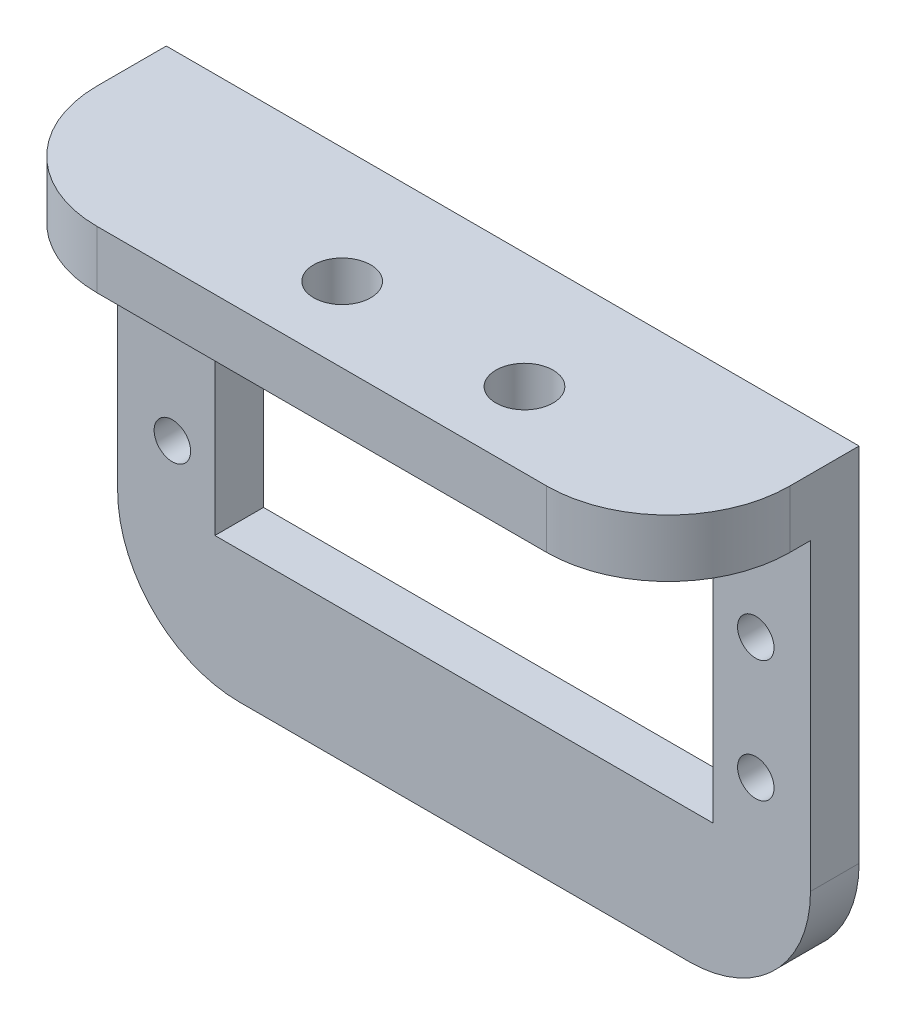
ISO-10303-21;
HEADER;
FILE_DESCRIPTION(('STEP AP214'),'2;1');
FILE_NAME('part.step','',(''),(''),'','','');
FILE_SCHEMA(('AUTOMOTIVE_DESIGN { 1 0 10303 214 1 1 1 1 }'));
ENDSEC;
DATA;
#1=APPLICATION_CONTEXT('core data for automotive mechanical design processes');
#2=APPLICATION_PROTOCOL_DEFINITION('international standard','automotive_design',2000,#1);
#3=PRODUCT_CONTEXT('',#1,'mechanical');
#4=PRODUCT('Part','Part','',(#3));
#5=PRODUCT_RELATED_PRODUCT_CATEGORY('part','',(#4));
#6=PRODUCT_DEFINITION_FORMATION('','',#4);
#7=PRODUCT_DEFINITION_CONTEXT('part definition',#1,'design');
#8=PRODUCT_DEFINITION('design','',#6,#7);
#9=PRODUCT_DEFINITION_SHAPE('','',#8);
#10=(LENGTH_UNIT() NAMED_UNIT(*) SI_UNIT(.MILLI.,.METRE.));
#11=(NAMED_UNIT(*) PLANE_ANGLE_UNIT() SI_UNIT($,.RADIAN.));
#12=(NAMED_UNIT(*) SI_UNIT($,.STERADIAN.) SOLID_ANGLE_UNIT());
#13=UNCERTAINTY_MEASURE_WITH_UNIT(LENGTH_MEASURE(1.E-05),#10,'distance_accuracy_value','');
#14=(GEOMETRIC_REPRESENTATION_CONTEXT(3) GLOBAL_UNCERTAINTY_ASSIGNED_CONTEXT((#13)) GLOBAL_UNIT_ASSIGNED_CONTEXT((#10,
#11,#12)) REPRESENTATION_CONTEXT('',''));
#15=CARTESIAN_POINT('',(0.,0.,0.));
#16=DIRECTION('',(0.,0.,1.));
#17=DIRECTION('',(1.,0.,0.));
#18=AXIS2_PLACEMENT_3D('',#15,#16,#17);
#19=CARTESIAN_POINT('',(-28.5,-20.86,-4.));
#20=DIRECTION('',(-1.,0.,0.));
#21=DIRECTION('',(0.,0.,1.));
#22=AXIS2_PLACEMENT_3D('',#19,#20,#21);
#23=PLANE('',#22);
#24=DIRECTION('',(0.,0.,1.));
#25=VECTOR('',#24,1.);
#26=CARTESIAN_POINT('',(-28.5,14.1400000000001,11.7));
#27=LINE('',#26,#25);
#28=CARTESIAN_POINT('',(-28.5,14.14,0.));
#29=VERTEX_POINT('',#28);
#30=CARTESIAN_POINT('',(-28.5,14.14,1.7));
#31=VERTEX_POINT('',#30);
#32=EDGE_CURVE('E205',#29,#31,#27,.T.);
#33=ORIENTED_EDGE('',*,*,#32,.T.);
#34=DIRECTION('',(0.,1.,0.));
#35=VECTOR('',#34,1.);
#36=CARTESIAN_POINT('',(-28.5,18.8766,1.69999999999998));
#37=LINE('',#36,#35);
#38=CARTESIAN_POINT('',(-28.5,18.8766,1.69999999999998));
#39=VERTEX_POINT('',#38);
#40=EDGE_CURVE('E13',#31,#39,#37,.T.);
#41=ORIENTED_EDGE('',*,*,#40,.T.);
#42=DIRECTION('',(0.,0.,1.));
#43=VECTOR('',#42,1.);
#44=CARTESIAN_POINT('',(-28.5,18.8766,0.));
#45=LINE('',#44,#43);
#46=CARTESIAN_POINT('',(-28.5,18.8766,-4.00000000000001));
#47=VERTEX_POINT('',#46);
#48=EDGE_CURVE('E179',#47,#39,#45,.T.);
#49=ORIENTED_EDGE('',*,*,#48,.F.);
#50=DIRECTION('',(0.,-1.,0.));
#51=VECTOR('',#50,1.);
#52=CARTESIAN_POINT('',(-28.5,-20.86,-4.));
#53=LINE('',#52,#51);
#54=CARTESIAN_POINT('',(-28.5,-10.86,-4.));
#55=VERTEX_POINT('',#54);
#56=EDGE_CURVE('E197',#47,#55,#53,.T.);
#57=ORIENTED_EDGE('',*,*,#56,.T.);
#58=DIRECTION('',(0.,0.,1.));
#59=VECTOR('',#58,1.);
#60=CARTESIAN_POINT('',(-28.5,-10.86,-4.));
#61=LINE('',#60,#59);
#62=CARTESIAN_POINT('',(-28.5,-10.86,0.));
#63=VERTEX_POINT('',#62);
#64=EDGE_CURVE('E191',#55,#63,#61,.T.);
#65=ORIENTED_EDGE('',*,*,#64,.T.);
#66=DIRECTION('',(0.,-1.,0.));
#67=VECTOR('',#66,1.);
#68=CARTESIAN_POINT('',(-28.5,-20.86,0.));
#69=LINE('',#68,#67);
#70=EDGE_CURVE('E285',#29,#63,#69,.T.);
#71=ORIENTED_EDGE('',*,*,#70,.F.);
#72=EDGE_LOOP('',(#33,#41,#49,#57,#65,#71));
#73=FACE_BOUND('',#72,.T.);
#74=ADVANCED_FACE('F67',(#73),#23,.T.);
#75=CARTESIAN_POINT('',(28.5,-20.86,-4.));
#76=DIRECTION('',(1.,0.,0.));
#77=DIRECTION('',(0.,0.,-1.));
#78=AXIS2_PLACEMENT_3D('',#75,#76,#77);
#79=PLANE('',#78);
#80=DIRECTION('',(0.,0.,-1.));
#81=VECTOR('',#80,1.);
#82=CARTESIAN_POINT('',(28.5,18.8766,0.));
#83=LINE('',#82,#81);
#84=CARTESIAN_POINT('',(28.5,18.8766,1.69999999999998));
#85=VERTEX_POINT('',#84);
#86=CARTESIAN_POINT('',(28.5,18.8766,-4.00000000000001));
#87=VERTEX_POINT('',#86);
#88=EDGE_CURVE('E170',#85,#87,#83,.T.);
#89=ORIENTED_EDGE('',*,*,#88,.F.);
#90=DIRECTION('',(0.,1.,0.));
#91=VECTOR('',#90,1.);
#92=CARTESIAN_POINT('',(28.5,14.14,1.7));
#93=LINE('',#92,#91);
#94=CARTESIAN_POINT('',(28.5,14.14,1.7));
#95=VERTEX_POINT('',#94);
#96=EDGE_CURVE('E91',#85,#95,#93,.F.);
#97=ORIENTED_EDGE('',*,*,#96,.T.);
#98=DIRECTION('',(0.,0.,-1.));
#99=VECTOR('',#98,1.);
#100=CARTESIAN_POINT('',(28.5,14.1400000000001,11.7));
#101=LINE('',#100,#99);
#102=CARTESIAN_POINT('',(28.5,14.14,0.));
#103=VERTEX_POINT('',#102);
#104=EDGE_CURVE('E200',#95,#103,#101,.T.);
#105=ORIENTED_EDGE('',*,*,#104,.T.);
#106=DIRECTION('',(0.,1.,0.));
#107=VECTOR('',#106,1.);
#108=CARTESIAN_POINT('',(28.5,-20.86,0.));
#109=LINE('',#108,#107);
#110=CARTESIAN_POINT('',(28.5,-10.86,0.));
#111=VERTEX_POINT('',#110);
#112=EDGE_CURVE('E308',#111,#103,#109,.T.);
#113=ORIENTED_EDGE('',*,*,#112,.F.);
#114=DIRECTION('',(0.,0.,1.));
#115=VECTOR('',#114,1.);
#116=CARTESIAN_POINT('',(28.5,-10.86,-4.));
#117=LINE('',#116,#115);
#118=CARTESIAN_POINT('',(28.5,-10.86,-4.));
#119=VERTEX_POINT('',#118);
#120=EDGE_CURVE('E187',#111,#119,#117,.F.);
#121=ORIENTED_EDGE('',*,*,#120,.T.);
#122=DIRECTION('',(0.,1.,0.));
#123=VECTOR('',#122,1.);
#124=CARTESIAN_POINT('',(28.5,-20.86,-4.));
#125=LINE('',#124,#123);
#126=EDGE_CURVE('E183',#119,#87,#125,.T.);
#127=ORIENTED_EDGE('',*,*,#126,.T.);
#128=EDGE_LOOP('',(#89,#97,#105,#113,#121,#127));
#129=FACE_BOUND('',#128,.T.);
#130=ADVANCED_FACE('F184',(#129),#79,.T.);
#131=CARTESIAN_POINT('',(-28.5,-20.86,-4.));
#132=DIRECTION('',(0.,-1.,0.));
#133=DIRECTION('',(0.,0.,-1.));
#134=AXIS2_PLACEMENT_3D('',#131,#132,#133);
#135=PLANE('',#134);
#136=DIRECTION('',(1.,0.,0.));
#137=VECTOR('',#136,1.);
#138=CARTESIAN_POINT('',(-28.5,-20.86,0.));
#139=LINE('',#138,#137);
#140=CARTESIAN_POINT('',(-18.5,-20.86,0.));
#141=VERTEX_POINT('',#140);
#142=CARTESIAN_POINT('',(18.5,-20.86,0.));
#143=VERTEX_POINT('',#142);
#144=EDGE_CURVE('E304',#141,#143,#139,.T.);
#145=ORIENTED_EDGE('',*,*,#144,.F.);
#146=DIRECTION('',(0.,0.,1.));
#147=VECTOR('',#146,1.);
#148=CARTESIAN_POINT('',(-18.5,-20.86,-4.));
#149=LINE('',#148,#147);
#150=CARTESIAN_POINT('',(-18.5,-20.86,-4.));
#151=VERTEX_POINT('',#150);
#152=EDGE_CURVE('E328',#141,#151,#149,.F.);
#153=ORIENTED_EDGE('',*,*,#152,.T.);
#154=DIRECTION('',(1.,0.,0.));
#155=VECTOR('',#154,1.);
#156=CARTESIAN_POINT('',(-28.5,-20.86,-4.));
#157=LINE('',#156,#155);
#158=CARTESIAN_POINT('',(18.5,-20.86,-4.));
#159=VERTEX_POINT('',#158);
#160=EDGE_CURVE('E192',#151,#159,#157,.T.);
#161=ORIENTED_EDGE('',*,*,#160,.T.);
#162=DIRECTION('',(0.,0.,1.));
#163=VECTOR('',#162,1.);
#164=CARTESIAN_POINT('',(18.5,-20.86,-4.));
#165=LINE('',#164,#163);
#166=EDGE_CURVE('E324',#159,#143,#165,.T.);
#167=ORIENTED_EDGE('',*,*,#166,.T.);
#168=EDGE_LOOP('',(#145,#153,#161,#167));
#169=FACE_BOUND('',#168,.T.);
#170=ADVANCED_FACE('F388',(#169),#135,.T.);
#171=CARTESIAN_POINT('',(0.,0.,-4.));
#172=DIRECTION('',(0.,0.,-1.));
#173=DIRECTION('',(-1.,0.,0.));
#174=AXIS2_PLACEMENT_3D('',#171,#172,#173);
#175=PLANE('',#174);
#176=CARTESIAN_POINT('',(-24.,-5.,-4.));
#177=DIRECTION('',(0.,0.,1.));
#178=DIRECTION('',(-1.,0.,0.));
#179=AXIS2_PLACEMENT_3D('',#176,#177,#178);
#180=CIRCLE('',#179,1.5);
#181=CARTESIAN_POINT('',(-25.5,-5.,-4.));
#182=VERTEX_POINT('',#181);
#183=EDGE_CURVE('E219',#182,#182,#180,.T.);
#184=ORIENTED_EDGE('',*,*,#183,.T.);
#185=EDGE_LOOP('',(#184));
#186=FACE_BOUND('',#185,.T.);
#187=CARTESIAN_POINT('',(24.,-5.,-4.));
#188=DIRECTION('',(0.,0.,1.));
#189=DIRECTION('',(1.,0.,0.));
#190=AXIS2_PLACEMENT_3D('',#187,#188,#189);
#191=CIRCLE('',#190,1.5);
#192=CARTESIAN_POINT('',(25.5,-5.,-4.));
#193=VERTEX_POINT('',#192);
#194=EDGE_CURVE('E227',#193,#193,#191,.T.);
#195=ORIENTED_EDGE('',*,*,#194,.T.);
#196=EDGE_LOOP('',(#195));
#197=FACE_BOUND('',#196,.T.);
#198=CARTESIAN_POINT('',(24.,5.,-4.));
#199=DIRECTION('',(0.,0.,1.));
#200=DIRECTION('',(-1.,0.,0.));
#201=AXIS2_PLACEMENT_3D('',#198,#199,#200);
#202=CIRCLE('',#201,1.5);
#203=CARTESIAN_POINT('',(22.5,5.,-4.));
#204=VERTEX_POINT('',#203);
#205=EDGE_CURVE('E235',#204,#204,#202,.T.);
#206=ORIENTED_EDGE('',*,*,#205,.T.);
#207=EDGE_LOOP('',(#206));
#208=FACE_BOUND('',#207,.T.);
#209=CARTESIAN_POINT('',(-24.,5.,-4.));
#210=DIRECTION('',(0.,0.,1.));
#211=DIRECTION('',(1.,0.,0.));
#212=AXIS2_PLACEMENT_3D('',#209,#210,#211);
#213=CIRCLE('',#212,1.5);
#214=CARTESIAN_POINT('',(-22.5,5.,-4.));
#215=VERTEX_POINT('',#214);
#216=EDGE_CURVE('E243',#215,#215,#213,.T.);
#217=ORIENTED_EDGE('',*,*,#216,.T.);
#218=EDGE_LOOP('',(#217));
#219=FACE_BOUND('',#218,.T.);
#220=DIRECTION('',(0.,1.,0.));
#221=VECTOR('',#220,1.);
#222=CARTESIAN_POINT('',(20.5,-10.,-4.));
#223=LINE('',#222,#221);
#224=CARTESIAN_POINT('',(20.5,-10.,-4.));
#225=VERTEX_POINT('',#224);
#226=CARTESIAN_POINT('',(20.5,9.99999999999999,-4.));
#227=VERTEX_POINT('',#226);
#228=EDGE_CURVE('E251',#225,#227,#223,.T.);
#229=ORIENTED_EDGE('',*,*,#228,.T.);
#230=DIRECTION('',(-1.,0.,0.));
#231=VECTOR('',#230,1.);
#232=CARTESIAN_POINT('',(-20.5,9.99999999999999,-4.));
#233=LINE('',#232,#231);
#234=CARTESIAN_POINT('',(-20.5,9.99999999999999,-4.));
#235=VERTEX_POINT('',#234);
#236=EDGE_CURVE('E255',#227,#235,#233,.T.);
#237=ORIENTED_EDGE('',*,*,#236,.T.);
#238=DIRECTION('',(0.,-1.,0.));
#239=VECTOR('',#238,1.);
#240=CARTESIAN_POINT('',(-20.5,-10.,-4.));
#241=LINE('',#240,#239);
#242=CARTESIAN_POINT('',(-20.5,-10.,-4.));
#243=VERTEX_POINT('',#242);
#244=EDGE_CURVE('E260',#235,#243,#241,.T.);
#245=ORIENTED_EDGE('',*,*,#244,.T.);
#246=DIRECTION('',(1.,0.,0.));
#247=VECTOR('',#246,1.);
#248=CARTESIAN_POINT('',(-20.5,-10.,-4.));
#249=LINE('',#248,#247);
#250=EDGE_CURVE('E264',#243,#225,#249,.T.);
#251=ORIENTED_EDGE('',*,*,#250,.T.);
#252=EDGE_LOOP('',(#229,#237,#245,#251));
#253=FACE_BOUND('',#252,.T.);
#254=ORIENTED_EDGE('',*,*,#160,.F.);
#255=CARTESIAN_POINT('',(-18.5,-10.86,-4.));
#256=DIRECTION('',(0.,0.,-1.));
#257=DIRECTION('',(-1.,0.,0.));
#258=AXIS2_PLACEMENT_3D('',#255,#256,#257);
#259=CIRCLE('',#258,10.);
#260=EDGE_CURVE('E334',#151,#55,#259,.T.);
#261=ORIENTED_EDGE('',*,*,#260,.T.);
#262=ORIENTED_EDGE('',*,*,#56,.F.);
#263=DIRECTION('',(-1.,0.,0.));
#264=VECTOR('',#263,1.);
#265=CARTESIAN_POINT('',(28.5,18.8766,-4.00000000000001));
#266=LINE('',#265,#264);
#267=EDGE_CURVE('E176',#87,#47,#266,.T.);
#268=ORIENTED_EDGE('',*,*,#267,.F.);
#269=ORIENTED_EDGE('',*,*,#126,.F.);
#270=CARTESIAN_POINT('',(18.5,-10.86,-4.));
#271=DIRECTION('',(0.,0.,-1.));
#272=DIRECTION('',(-1.,0.,0.));
#273=AXIS2_PLACEMENT_3D('',#270,#271,#272);
#274=CIRCLE('',#273,10.);
#275=EDGE_CURVE('E331',#119,#159,#274,.T.);
#276=ORIENTED_EDGE('',*,*,#275,.T.);
#277=EDGE_LOOP('',(#254,#261,#262,#268,#269,#276));
#278=FACE_BOUND('',#277,.T.);
#279=ADVANCED_FACE('F195',(#186,#197,#208,#219,#253,#278),#175,.T.);
#280=CARTESIAN_POINT('',(0.,0.,0.));
#281=DIRECTION('',(0.,0.,-1.));
#282=DIRECTION('',(-1.,0.,0.));
#283=AXIS2_PLACEMENT_3D('',#280,#281,#282);
#284=PLANE('',#283);
#285=CARTESIAN_POINT('',(-24.,-5.,0.));
#286=DIRECTION('',(0.,0.,1.));
#287=DIRECTION('',(-1.,0.,0.));
#288=AXIS2_PLACEMENT_3D('',#285,#286,#287);
#289=CIRCLE('',#288,1.5);
#290=CARTESIAN_POINT('',(-25.5,-5.,0.));
#291=VERTEX_POINT('',#290);
#292=EDGE_CURVE('E216',#291,#291,#289,.T.);
#293=ORIENTED_EDGE('',*,*,#292,.F.);
#294=EDGE_LOOP('',(#293));
#295=FACE_BOUND('',#294,.T.);
#296=CARTESIAN_POINT('',(24.,-5.,0.));
#297=DIRECTION('',(0.,0.,1.));
#298=DIRECTION('',(1.,0.,0.));
#299=AXIS2_PLACEMENT_3D('',#296,#297,#298);
#300=CIRCLE('',#299,1.5);
#301=CARTESIAN_POINT('',(25.5,-5.,0.));
#302=VERTEX_POINT('',#301);
#303=EDGE_CURVE('E223',#302,#302,#300,.T.);
#304=ORIENTED_EDGE('',*,*,#303,.F.);
#305=EDGE_LOOP('',(#304));
#306=FACE_BOUND('',#305,.T.);
#307=CARTESIAN_POINT('',(24.,5.,0.));
#308=DIRECTION('',(0.,0.,1.));
#309=DIRECTION('',(-1.,0.,0.));
#310=AXIS2_PLACEMENT_3D('',#307,#308,#309);
#311=CIRCLE('',#310,1.5);
#312=CARTESIAN_POINT('',(22.5,5.,0.));
#313=VERTEX_POINT('',#312);
#314=EDGE_CURVE('E231',#313,#313,#311,.T.);
#315=ORIENTED_EDGE('',*,*,#314,.F.);
#316=EDGE_LOOP('',(#315));
#317=FACE_BOUND('',#316,.T.);
#318=CARTESIAN_POINT('',(-24.,5.,0.));
#319=DIRECTION('',(0.,0.,1.));
#320=DIRECTION('',(1.,0.,0.));
#321=AXIS2_PLACEMENT_3D('',#318,#319,#320);
#322=CIRCLE('',#321,1.5);
#323=CARTESIAN_POINT('',(-22.5,5.,0.));
#324=VERTEX_POINT('',#323);
#325=EDGE_CURVE('E239',#324,#324,#322,.T.);
#326=ORIENTED_EDGE('',*,*,#325,.F.);
#327=EDGE_LOOP('',(#326));
#328=FACE_BOUND('',#327,.T.);
#329=DIRECTION('',(-1.,0.,0.));
#330=VECTOR('',#329,1.);
#331=CARTESIAN_POINT('',(-20.5,9.99999999999999,0.));
#332=LINE('',#331,#330);
#333=CARTESIAN_POINT('',(20.5,9.99999999999999,0.));
#334=VERTEX_POINT('',#333);
#335=CARTESIAN_POINT('',(-20.5,9.99999999999999,0.));
#336=VERTEX_POINT('',#335);
#337=EDGE_CURVE('E271',#334,#336,#332,.T.);
#338=ORIENTED_EDGE('',*,*,#337,.F.);
#339=DIRECTION('',(0.,1.,0.));
#340=VECTOR('',#339,1.);
#341=CARTESIAN_POINT('',(20.5,-10.,0.));
#342=LINE('',#341,#340);
#343=CARTESIAN_POINT('',(20.5,-10.,0.));
#344=VERTEX_POINT('',#343);
#345=EDGE_CURVE('E247',#344,#334,#342,.T.);
#346=ORIENTED_EDGE('',*,*,#345,.F.);
#347=DIRECTION('',(1.,0.,0.));
#348=VECTOR('',#347,1.);
#349=CARTESIAN_POINT('',(-20.5,-10.,0.));
#350=LINE('',#349,#348);
#351=CARTESIAN_POINT('',(-20.5,-10.,0.));
#352=VERTEX_POINT('',#351);
#353=EDGE_CURVE('E256',#352,#344,#350,.T.);
#354=ORIENTED_EDGE('',*,*,#353,.F.);
#355=DIRECTION('',(0.,-1.,0.));
#356=VECTOR('',#355,1.);
#357=CARTESIAN_POINT('',(-20.5,-10.,0.));
#358=LINE('',#357,#356);
#359=EDGE_CURVE('E275',#336,#352,#358,.T.);
#360=ORIENTED_EDGE('',*,*,#359,.F.);
#361=EDGE_LOOP('',(#338,#346,#354,#360));
#362=FACE_BOUND('',#361,.T.);
#363=ORIENTED_EDGE('',*,*,#70,.T.);
#364=CARTESIAN_POINT('',(-18.5,-10.86,0.));
#365=DIRECTION('',(0.,0.,-1.));
#366=DIRECTION('',(-1.,0.,0.));
#367=AXIS2_PLACEMENT_3D('',#364,#365,#366);
#368=CIRCLE('',#367,10.);
#369=EDGE_CURVE('E321',#63,#141,#368,.F.);
#370=ORIENTED_EDGE('',*,*,#369,.T.);
#371=ORIENTED_EDGE('',*,*,#144,.T.);
#372=CARTESIAN_POINT('',(18.5,-10.86,0.));
#373=DIRECTION('',(0.,0.,-1.));
#374=DIRECTION('',(-1.,0.,0.));
#375=AXIS2_PLACEMENT_3D('',#372,#373,#374);
#376=CIRCLE('',#375,10.);
#377=EDGE_CURVE('E318',#143,#111,#376,.F.);
#378=ORIENTED_EDGE('',*,*,#377,.T.);
#379=ORIENTED_EDGE('',*,*,#112,.T.);
#380=DIRECTION('',(-1.,0.,0.));
#381=VECTOR('',#380,1.);
#382=CARTESIAN_POINT('',(-28.5,14.14,0.));
#383=LINE('',#382,#381);
#384=EDGE_CURVE('E297',#103,#29,#383,.T.);
#385=ORIENTED_EDGE('',*,*,#384,.T.);
#386=EDGE_LOOP('',(#363,#370,#371,#378,#379,#385));
#387=FACE_BOUND('',#386,.T.);
#388=ADVANCED_FACE('F468',(#295,#306,#317,#328,#362,#387),#284,.F.);
#389=CARTESIAN_POINT('',(20.5,-10.,-4.));
#390=DIRECTION('',(1.,0.,0.));
#391=DIRECTION('',(0.,0.,-1.));
#392=AXIS2_PLACEMENT_3D('',#389,#390,#391);
#393=PLANE('',#392);
#394=ORIENTED_EDGE('',*,*,#345,.T.);
#395=DIRECTION('',(0.,0.,1.));
#396=VECTOR('',#395,1.);
#397=CARTESIAN_POINT('',(20.5,9.99999999999999,-4.));
#398=LINE('',#397,#396);
#399=EDGE_CURVE('E268',#227,#334,#398,.T.);
#400=ORIENTED_EDGE('',*,*,#399,.F.);
#401=ORIENTED_EDGE('',*,*,#228,.F.);
#402=DIRECTION('',(0.,0.,1.));
#403=VECTOR('',#402,1.);
#404=CARTESIAN_POINT('',(20.5,-10.,-4.));
#405=LINE('',#404,#403);
#406=EDGE_CURVE('E282',#225,#344,#405,.T.);
#407=ORIENTED_EDGE('',*,*,#406,.T.);
#408=EDGE_LOOP('',(#394,#400,#401,#407));
#409=FACE_BOUND('',#408,.T.);
#410=ADVANCED_FACE('F458',(#409),#393,.F.);
#411=CARTESIAN_POINT('',(-20.5,-10.,-4.));
#412=DIRECTION('',(0.,-1.,0.));
#413=DIRECTION('',(0.,0.,-1.));
#414=AXIS2_PLACEMENT_3D('',#411,#412,#413);
#415=PLANE('',#414);
#416=ORIENTED_EDGE('',*,*,#353,.T.);
#417=ORIENTED_EDGE('',*,*,#406,.F.);
#418=ORIENTED_EDGE('',*,*,#250,.F.);
#419=DIRECTION('',(0.,0.,1.));
#420=VECTOR('',#419,1.);
#421=CARTESIAN_POINT('',(-20.5,-10.,-4.));
#422=LINE('',#421,#420);
#423=EDGE_CURVE('E286',#243,#352,#422,.T.);
#424=ORIENTED_EDGE('',*,*,#423,.T.);
#425=EDGE_LOOP('',(#416,#417,#418,#424));
#426=FACE_BOUND('',#425,.T.);
#427=ADVANCED_FACE('F454',(#426),#415,.F.);
#428=CARTESIAN_POINT('',(-20.5,-10.,-4.));
#429=DIRECTION('',(-1.,0.,0.));
#430=DIRECTION('',(0.,0.,1.));
#431=AXIS2_PLACEMENT_3D('',#428,#429,#430);
#432=PLANE('',#431);
#433=ORIENTED_EDGE('',*,*,#359,.T.);
#434=ORIENTED_EDGE('',*,*,#423,.F.);
#435=ORIENTED_EDGE('',*,*,#244,.F.);
#436=DIRECTION('',(0.,0.,1.));
#437=VECTOR('',#436,1.);
#438=CARTESIAN_POINT('',(-20.5,9.99999999999999,-4.));
#439=LINE('',#438,#437);
#440=EDGE_CURVE('E289',#235,#336,#439,.T.);
#441=ORIENTED_EDGE('',*,*,#440,.T.);
#442=EDGE_LOOP('',(#433,#434,#435,#441));
#443=FACE_BOUND('',#442,.T.);
#444=ADVANCED_FACE('F457',(#443),#432,.F.);
#445=CARTESIAN_POINT('',(-20.5,9.99999999999999,-4.));
#446=DIRECTION('',(0.,1.,0.));
#447=DIRECTION('',(0.,0.,1.));
#448=AXIS2_PLACEMENT_3D('',#445,#446,#447);
#449=PLANE('',#448);
#450=ORIENTED_EDGE('',*,*,#337,.T.);
#451=ORIENTED_EDGE('',*,*,#440,.F.);
#452=ORIENTED_EDGE('',*,*,#236,.F.);
#453=ORIENTED_EDGE('',*,*,#399,.T.);
#454=EDGE_LOOP('',(#450,#451,#452,#453));
#455=FACE_BOUND('',#454,.T.);
#456=ADVANCED_FACE('F452',(#455),#449,.F.);
#457=CARTESIAN_POINT('',(-24.,5.,-4.));
#458=DIRECTION('',(0.,0.,1.));
#459=DIRECTION('',(1.,0.,0.));
#460=AXIS2_PLACEMENT_3D('',#457,#458,#459);
#461=CYLINDRICAL_SURFACE('',#460,1.5);
#462=ORIENTED_EDGE('',*,*,#216,.F.);
#463=EDGE_LOOP('',(#462));
#464=FACE_BOUND('',#463,.T.);
#465=ORIENTED_EDGE('',*,*,#325,.T.);
#466=EDGE_LOOP('',(#465));
#467=FACE_BOUND('',#466,.T.);
#468=ADVANCED_FACE('F448',(#464,#467),#461,.F.);
#469=CARTESIAN_POINT('',(24.,5.,-4.));
#470=DIRECTION('',(0.,0.,1.));
#471=DIRECTION('',(1.,0.,0.));
#472=AXIS2_PLACEMENT_3D('',#469,#470,#471);
#473=CYLINDRICAL_SURFACE('',#472,1.5);
#474=ORIENTED_EDGE('',*,*,#205,.F.);
#475=EDGE_LOOP('',(#474));
#476=FACE_BOUND('',#475,.T.);
#477=ORIENTED_EDGE('',*,*,#314,.T.);
#478=EDGE_LOOP('',(#477));
#479=FACE_BOUND('',#478,.T.);
#480=ADVANCED_FACE('F444',(#476,#479),#473,.F.);
#481=CARTESIAN_POINT('',(24.,-5.,-4.));
#482=DIRECTION('',(0.,0.,1.));
#483=DIRECTION('',(1.,0.,0.));
#484=AXIS2_PLACEMENT_3D('',#481,#482,#483);
#485=CYLINDRICAL_SURFACE('',#484,1.5);
#486=ORIENTED_EDGE('',*,*,#194,.F.);
#487=EDGE_LOOP('',(#486));
#488=FACE_BOUND('',#487,.T.);
#489=ORIENTED_EDGE('',*,*,#303,.T.);
#490=EDGE_LOOP('',(#489));
#491=FACE_BOUND('',#490,.T.);
#492=ADVANCED_FACE('F440',(#488,#491),#485,.F.);
#493=CARTESIAN_POINT('',(-24.,-5.,-4.));
#494=DIRECTION('',(0.,0.,1.));
#495=DIRECTION('',(1.,0.,0.));
#496=AXIS2_PLACEMENT_3D('',#493,#494,#495);
#497=CYLINDRICAL_SURFACE('',#496,1.5);
#498=ORIENTED_EDGE('',*,*,#183,.F.);
#499=EDGE_LOOP('',(#498));
#500=FACE_BOUND('',#499,.T.);
#501=ORIENTED_EDGE('',*,*,#292,.T.);
#502=EDGE_LOOP('',(#501));
#503=FACE_BOUND('',#502,.T.);
#504=ADVANCED_FACE('F424',(#500,#503),#497,.F.);
#505=CARTESIAN_POINT('',(0.,18.8766,0.));
#506=DIRECTION('',(0.,-1.,0.));
#507=DIRECTION('',(0.,0.,-1.));
#508=AXIS2_PLACEMENT_3D('',#505,#506,#507);
#509=PLANE('',#508);
#510=CARTESIAN_POINT('',(10.5,18.8766,5.53000000000001));
#511=DIRECTION('',(0.,1.,0.));
#512=DIRECTION('',(0.,0.,1.));
#513=AXIS2_PLACEMENT_3D('',#510,#511,#512);
#514=CIRCLE('',#513,2.35);
#515=CARTESIAN_POINT('',(10.5,18.8766,7.88000000000001));
#516=VERTEX_POINT('',#515);
#517=EDGE_CURVE('E342',#516,#516,#514,.T.);
#518=ORIENTED_EDGE('',*,*,#517,.F.);
#519=EDGE_LOOP('',(#518));
#520=FACE_BOUND('',#519,.T.);
#521=CARTESIAN_POINT('',(-4.50000000000001,18.8766,5.53000000000001));
#522=DIRECTION('',(0.,1.,0.));
#523=DIRECTION('',(0.,0.,1.));
#524=AXIS2_PLACEMENT_3D('',#521,#522,#523);
#525=CIRCLE('',#524,2.35);
#526=CARTESIAN_POINT('',(-4.50000000000001,18.8766,7.88000000000001));
#527=VERTEX_POINT('',#526);
#528=EDGE_CURVE('E413',#527,#527,#525,.T.);
#529=ORIENTED_EDGE('',*,*,#528,.F.);
#530=EDGE_LOOP('',(#529));
#531=FACE_BOUND('',#530,.T.);
#532=DIRECTION('',(1.,0.,0.));
#533=VECTOR('',#532,1.);
#534=CARTESIAN_POINT('',(0.,18.8766,11.7));
#535=LINE('',#534,#533);
#536=CARTESIAN_POINT('',(-18.5,18.8766,11.7));
#537=VERTEX_POINT('',#536);
#538=CARTESIAN_POINT('',(18.5,18.8766,11.7));
#539=VERTEX_POINT('',#538);
#540=EDGE_CURVE('E213',#537,#539,#535,.T.);
#541=ORIENTED_EDGE('',*,*,#540,.T.);
#542=CARTESIAN_POINT('',(18.5,18.8766,1.69999999999998));
#543=DIRECTION('',(0.,-1.,0.));
#544=DIRECTION('',(0.,0.,-1.));
#545=AXIS2_PLACEMENT_3D('',#542,#543,#544);
#546=CIRCLE('',#545,10.);
#547=EDGE_CURVE('E177',#539,#85,#546,.F.);
#548=ORIENTED_EDGE('',*,*,#547,.T.);
#549=ORIENTED_EDGE('',*,*,#88,.T.);
#550=ORIENTED_EDGE('',*,*,#267,.T.);
#551=ORIENTED_EDGE('',*,*,#48,.T.);
#552=CARTESIAN_POINT('',(-18.5,18.8766,1.69999999999998));
#553=DIRECTION('',(0.,-1.,0.));
#554=DIRECTION('',(0.,0.,-1.));
#555=AXIS2_PLACEMENT_3D('',#552,#553,#554);
#556=CIRCLE('',#555,10.);
#557=EDGE_CURVE('E350',#39,#537,#556,.F.);
#558=ORIENTED_EDGE('',*,*,#557,.T.);
#559=EDGE_LOOP('',(#541,#548,#549,#550,#551,#558));
#560=FACE_BOUND('',#559,.T.);
#561=ADVANCED_FACE('F173',(#520,#531,#560),#509,.F.);
#562=CARTESIAN_POINT('',(28.5,18.8766,11.7));
#563=DIRECTION('',(0.,0.,-1.));
#564=DIRECTION('',(0.,1.,0.));
#565=AXIS2_PLACEMENT_3D('',#562,#563,#564);
#566=PLANE('',#565);
#567=DIRECTION('',(1.,0.,0.));
#568=VECTOR('',#567,1.);
#569=CARTESIAN_POINT('',(28.5,14.1400000000001,11.7));
#570=LINE('',#569,#568);
#571=CARTESIAN_POINT('',(-18.5,14.1400000000001,11.7));
#572=VERTEX_POINT('',#571);
#573=CARTESIAN_POINT('',(18.5,14.1400000000001,11.7));
#574=VERTEX_POINT('',#573);
#575=EDGE_CURVE('E180',#572,#574,#570,.T.);
#576=ORIENTED_EDGE('',*,*,#575,.T.);
#577=DIRECTION('',(0.,1.,0.));
#578=VECTOR('',#577,1.);
#579=CARTESIAN_POINT('',(18.5,18.8766,11.7));
#580=LINE('',#579,#578);
#581=EDGE_CURVE('E346',#574,#539,#580,.T.);
#582=ORIENTED_EDGE('',*,*,#581,.T.);
#583=ORIENTED_EDGE('',*,*,#540,.F.);
#584=DIRECTION('',(0.,1.,0.));
#585=VECTOR('',#584,1.);
#586=CARTESIAN_POINT('',(-18.5,14.1400000000001,11.7));
#587=LINE('',#586,#585);
#588=EDGE_CURVE('E339',#537,#572,#587,.F.);
#589=ORIENTED_EDGE('',*,*,#588,.T.);
#590=EDGE_LOOP('',(#576,#582,#583,#589));
#591=FACE_BOUND('',#590,.T.);
#592=ADVANCED_FACE('F366',(#591),#566,.F.);
#593=CARTESIAN_POINT('',(-18.5,-10.86,-4.));
#594=DIRECTION('',(0.,0.,1.));
#595=DIRECTION('',(1.,0.,0.));
#596=AXIS2_PLACEMENT_3D('',#593,#594,#595);
#597=CYLINDRICAL_SURFACE('',#596,10.);
#598=ORIENTED_EDGE('',*,*,#260,.F.);
#599=ORIENTED_EDGE('',*,*,#152,.F.);
#600=ORIENTED_EDGE('',*,*,#369,.F.);
#601=ORIENTED_EDGE('',*,*,#64,.F.);
#602=EDGE_LOOP('',(#598,#599,#600,#601));
#603=FACE_BOUND('',#602,.T.);
#604=ADVANCED_FACE('F392',(#603),#597,.T.);
#605=CARTESIAN_POINT('',(18.5,-10.86,-4.));
#606=DIRECTION('',(0.,0.,1.));
#607=DIRECTION('',(1.,0.,0.));
#608=AXIS2_PLACEMENT_3D('',#605,#606,#607);
#609=CYLINDRICAL_SURFACE('',#608,10.);
#610=ORIENTED_EDGE('',*,*,#275,.F.);
#611=ORIENTED_EDGE('',*,*,#120,.F.);
#612=ORIENTED_EDGE('',*,*,#377,.F.);
#613=ORIENTED_EDGE('',*,*,#166,.F.);
#614=EDGE_LOOP('',(#610,#611,#612,#613));
#615=FACE_BOUND('',#614,.T.);
#616=ADVANCED_FACE('F394',(#615),#609,.T.);
#617=CARTESIAN_POINT('',(0.,14.14,0.));
#618=DIRECTION('',(0.,1.,0.));
#619=DIRECTION('',(0.,0.,1.));
#620=AXIS2_PLACEMENT_3D('',#617,#618,#619);
#621=PLANE('',#620);
#622=CARTESIAN_POINT('',(10.5,14.14,5.53000000000002));
#623=DIRECTION('',(0.,1.,0.));
#624=DIRECTION('',(0.,0.,1.));
#625=AXIS2_PLACEMENT_3D('',#622,#623,#624);
#626=CIRCLE('',#625,2.35);
#627=CARTESIAN_POINT('',(10.5,14.14,7.88000000000003));
#628=VERTEX_POINT('',#627);
#629=EDGE_CURVE('E201',#628,#628,#626,.T.);
#630=ORIENTED_EDGE('',*,*,#629,.T.);
#631=EDGE_LOOP('',(#630));
#632=FACE_BOUND('',#631,.T.);
#633=CARTESIAN_POINT('',(-4.50000000000001,14.14,5.53000000000002));
#634=DIRECTION('',(0.,1.,0.));
#635=DIRECTION('',(0.,0.,1.));
#636=AXIS2_PLACEMENT_3D('',#633,#634,#635);
#637=CIRCLE('',#636,2.35);
#638=CARTESIAN_POINT('',(-4.50000000000001,14.14,7.88000000000002));
#639=VERTEX_POINT('',#638);
#640=EDGE_CURVE('E208',#639,#639,#637,.T.);
#641=ORIENTED_EDGE('',*,*,#640,.T.);
#642=EDGE_LOOP('',(#641));
#643=FACE_BOUND('',#642,.T.);
#644=ORIENTED_EDGE('',*,*,#104,.F.);
#645=CARTESIAN_POINT('',(18.5,14.14,1.7));
#646=DIRECTION('',(0.,1.,0.));
#647=DIRECTION('',(0.,0.,1.));
#648=AXIS2_PLACEMENT_3D('',#645,#646,#647);
#649=CIRCLE('',#648,10.);
#650=EDGE_CURVE('E76',#95,#574,#649,.F.);
#651=ORIENTED_EDGE('',*,*,#650,.T.);
#652=ORIENTED_EDGE('',*,*,#575,.F.);
#653=CARTESIAN_POINT('',(-18.5,14.14,1.7));
#654=DIRECTION('',(0.,1.,0.));
#655=DIRECTION('',(0.,0.,1.));
#656=AXIS2_PLACEMENT_3D('',#653,#654,#655);
#657=CIRCLE('',#656,10.);
#658=EDGE_CURVE('E83',#572,#31,#657,.F.);
#659=ORIENTED_EDGE('',*,*,#658,.T.);
#660=ORIENTED_EDGE('',*,*,#32,.F.);
#661=ORIENTED_EDGE('',*,*,#384,.F.);
#662=EDGE_LOOP('',(#644,#651,#652,#659,#660,#661));
#663=FACE_BOUND('',#662,.T.);
#664=ADVANCED_FACE('F361',(#632,#643,#663),#621,.F.);
#665=CARTESIAN_POINT('',(-4.50000000000001,-20.86,5.53000000000015));
#666=DIRECTION('',(0.,1.,0.));
#667=DIRECTION('',(0.,0.,1.));
#668=AXIS2_PLACEMENT_3D('',#665,#666,#667);
#669=CYLINDRICAL_SURFACE('',#668,2.35);
#670=ORIENTED_EDGE('',*,*,#528,.T.);
#671=EDGE_LOOP('',(#670));
#672=FACE_BOUND('',#671,.T.);
#673=ORIENTED_EDGE('',*,*,#640,.F.);
#674=EDGE_LOOP('',(#673));
#675=FACE_BOUND('',#674,.T.);
#676=ADVANCED_FACE('F378',(#672,#675),#669,.F.);
#677=CARTESIAN_POINT('',(10.5,-20.86,5.53000000000015));
#678=DIRECTION('',(0.,1.,0.));
#679=DIRECTION('',(0.,0.,1.));
#680=AXIS2_PLACEMENT_3D('',#677,#678,#679);
#681=CYLINDRICAL_SURFACE('',#680,2.35);
#682=ORIENTED_EDGE('',*,*,#517,.T.);
#683=EDGE_LOOP('',(#682));
#684=FACE_BOUND('',#683,.T.);
#685=ORIENTED_EDGE('',*,*,#629,.F.);
#686=EDGE_LOOP('',(#685));
#687=FACE_BOUND('',#686,.T.);
#688=ADVANCED_FACE('F372',(#684,#687),#681,.F.);
#689=CARTESIAN_POINT('',(18.5,18.8766,1.69999999999998));
#690=DIRECTION('',(0.,-1.,0.));
#691=DIRECTION('',(0.,0.,-1.));
#692=AXIS2_PLACEMENT_3D('',#689,#690,#691);
#693=CYLINDRICAL_SURFACE('',#692,10.);
#694=ORIENTED_EDGE('',*,*,#650,.F.);
#695=ORIENTED_EDGE('',*,*,#96,.F.);
#696=ORIENTED_EDGE('',*,*,#547,.F.);
#697=ORIENTED_EDGE('',*,*,#581,.F.);
#698=EDGE_LOOP('',(#694,#695,#696,#697));
#699=FACE_BOUND('',#698,.T.);
#700=ADVANCED_FACE('F370',(#699),#693,.T.);
#701=CARTESIAN_POINT('',(-18.5,-20.86,1.70000000000012));
#702=DIRECTION('',(0.,-1.,0.));
#703=DIRECTION('',(0.,0.,-1.));
#704=AXIS2_PLACEMENT_3D('',#701,#702,#703);
#705=CYLINDRICAL_SURFACE('',#704,10.);
#706=ORIENTED_EDGE('',*,*,#658,.F.);
#707=ORIENTED_EDGE('',*,*,#588,.F.);
#708=ORIENTED_EDGE('',*,*,#557,.F.);
#709=ORIENTED_EDGE('',*,*,#40,.F.);
#710=EDGE_LOOP('',(#706,#707,#708,#709));
#711=FACE_BOUND('',#710,.T.);
#712=ADVANCED_FACE('F69',(#711),#705,.T.);
#713=CLOSED_SHELL('',(#74,#130,#170,#279,#388,#410,#427,#444,#456,#468,#480,#492,#504,#561,#592,
#604,#616,#664,#676,#688,#700,#712));
#714=MANIFOLD_SOLID_BREP('B2',#713);
#715=ADVANCED_BREP_SHAPE_REPRESENTATION('',(#18,#714),#14);
#716=SHAPE_DEFINITION_REPRESENTATION(#9,#715);
ENDSEC;
END-ISO-10303-21;
